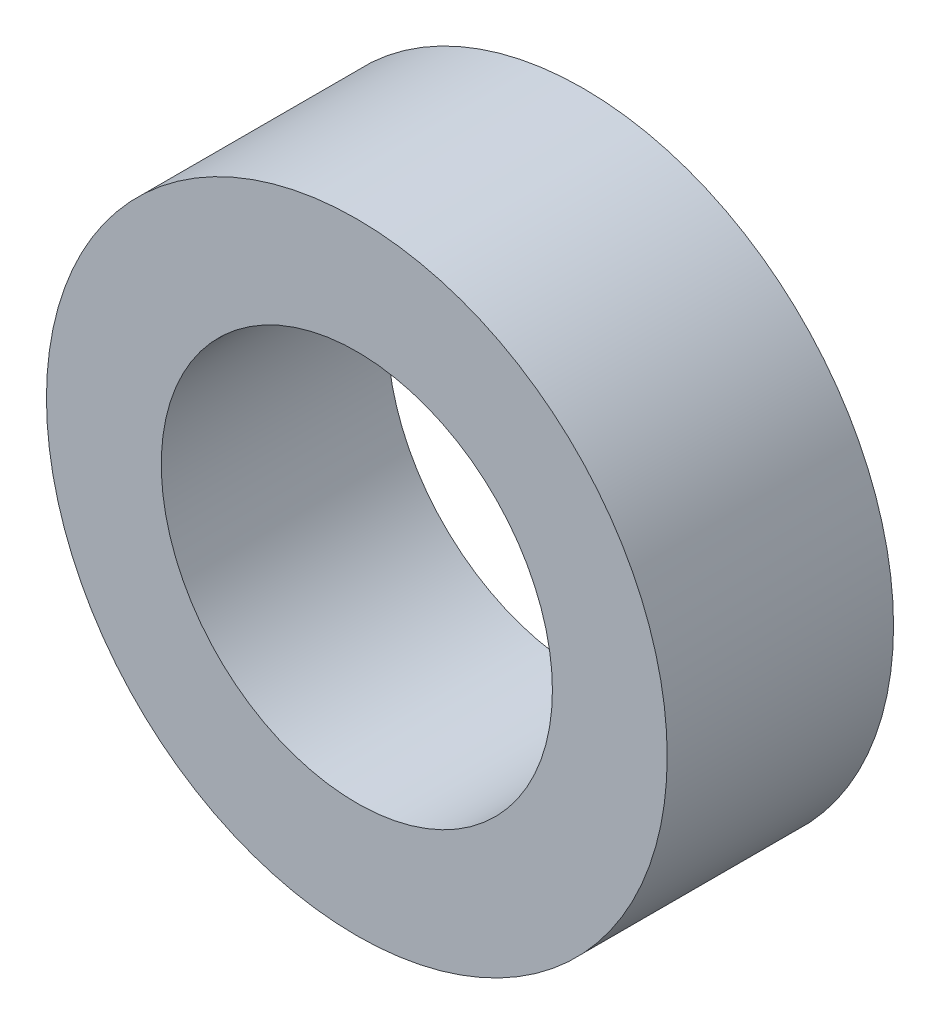
ISO-10303-21;
HEADER;
FILE_DESCRIPTION(('STEP AP214'),'2;1');
FILE_NAME('part.step','',(''),(''),'','','');
FILE_SCHEMA(('AUTOMOTIVE_DESIGN { 1 0 10303 214 1 1 1 1 }'));
ENDSEC;
DATA;
#1=APPLICATION_CONTEXT('core data for automotive mechanical design processes');
#2=APPLICATION_PROTOCOL_DEFINITION('international standard','automotive_design',2000,#1);
#3=PRODUCT_CONTEXT('',#1,'mechanical');
#4=PRODUCT('Part','Part','',(#3));
#5=PRODUCT_RELATED_PRODUCT_CATEGORY('part','',(#4));
#6=PRODUCT_DEFINITION_FORMATION('','',#4);
#7=PRODUCT_DEFINITION_CONTEXT('part definition',#1,'design');
#8=PRODUCT_DEFINITION('design','',#6,#7);
#9=PRODUCT_DEFINITION_SHAPE('','',#8);
#10=(LENGTH_UNIT() NAMED_UNIT(*) SI_UNIT(.MILLI.,.METRE.));
#11=(NAMED_UNIT(*) PLANE_ANGLE_UNIT() SI_UNIT($,.RADIAN.));
#12=(NAMED_UNIT(*) SI_UNIT($,.STERADIAN.) SOLID_ANGLE_UNIT());
#13=UNCERTAINTY_MEASURE_WITH_UNIT(LENGTH_MEASURE(1.E-05),#10,'distance_accuracy_value','');
#14=(GEOMETRIC_REPRESENTATION_CONTEXT(3) GLOBAL_UNCERTAINTY_ASSIGNED_CONTEXT((#13)) GLOBAL_UNIT_ASSIGNED_CONTEXT((#10,
#11,#12)) REPRESENTATION_CONTEXT('',''));
#15=CARTESIAN_POINT('',(0.,0.,0.));
#16=DIRECTION('',(0.,0.,1.));
#17=DIRECTION('',(1.,0.,0.));
#18=AXIS2_PLACEMENT_3D('',#15,#16,#17);
#19=CARTESIAN_POINT('',(0.,0.,3.46));
#20=DIRECTION('',(0.,0.,1.));
#21=DIRECTION('',(1.,0.,0.));
#22=AXIS2_PLACEMENT_3D('',#19,#20,#21);
#23=PLANE('',#22);
#24=CARTESIAN_POINT('',(0.,0.,3.46));
#25=DIRECTION('',(0.,0.,1.));
#26=DIRECTION('',(1.,0.,0.));
#27=AXIS2_PLACEMENT_3D('',#24,#25,#26);
#28=CIRCLE('',#27,4.745);
#29=CARTESIAN_POINT('',(4.745,0.,3.46));
#30=VERTEX_POINT('',#29);
#31=EDGE_CURVE('E10',#30,#30,#28,.T.);
#32=ORIENTED_EDGE('',*,*,#31,.T.);
#33=EDGE_LOOP('',(#32));
#34=FACE_BOUND('',#33,.T.);
#35=CARTESIAN_POINT('',(0.,0.,3.46));
#36=DIRECTION('',(0.,0.,1.));
#37=DIRECTION('',(1.,0.,0.));
#38=AXIS2_PLACEMENT_3D('',#35,#36,#37);
#39=CIRCLE('',#38,2.99);
#40=CARTESIAN_POINT('',(2.99,0.,3.46));
#41=VERTEX_POINT('',#40);
#42=EDGE_CURVE('E43',#41,#41,#39,.T.);
#43=ORIENTED_EDGE('',*,*,#42,.F.);
#44=EDGE_LOOP('',(#43));
#45=FACE_BOUND('',#44,.T.);
#46=ADVANCED_FACE('F32',(#34,#45),#23,.T.);
#47=CARTESIAN_POINT('',(0.,0.,0.));
#48=DIRECTION('',(0.,0.,1.));
#49=DIRECTION('',(1.,0.,0.));
#50=AXIS2_PLACEMENT_3D('',#47,#48,#49);
#51=PLANE('',#50);
#52=CARTESIAN_POINT('',(0.,0.,0.));
#53=DIRECTION('',(0.,0.,1.));
#54=DIRECTION('',(1.,0.,0.));
#55=AXIS2_PLACEMENT_3D('',#52,#53,#54);
#56=CIRCLE('',#55,4.745);
#57=CARTESIAN_POINT('',(4.745,0.,0.));
#58=VERTEX_POINT('',#57);
#59=EDGE_CURVE('E36',#58,#58,#56,.T.);
#60=ORIENTED_EDGE('',*,*,#59,.F.);
#61=EDGE_LOOP('',(#60));
#62=FACE_BOUND('',#61,.T.);
#63=CARTESIAN_POINT('',(0.,0.,0.));
#64=DIRECTION('',(0.,0.,1.));
#65=DIRECTION('',(1.,0.,0.));
#66=AXIS2_PLACEMENT_3D('',#63,#64,#65);
#67=CIRCLE('',#66,2.99);
#68=CARTESIAN_POINT('',(2.99,0.,0.));
#69=VERTEX_POINT('',#68);
#70=EDGE_CURVE('E45',#69,#69,#67,.T.);
#71=ORIENTED_EDGE('',*,*,#70,.T.);
#72=EDGE_LOOP('',(#71));
#73=FACE_BOUND('',#72,.T.);
#74=ADVANCED_FACE('F55',(#62,#73),#51,.F.);
#75=CARTESIAN_POINT('',(0.,0.,3.46));
#76=DIRECTION('',(0.,0.,-1.));
#77=DIRECTION('',(-1.,0.,0.));
#78=AXIS2_PLACEMENT_3D('',#75,#76,#77);
#79=CYLINDRICAL_SURFACE('',#78,4.745);
#80=ORIENTED_EDGE('',*,*,#31,.F.);
#81=EDGE_LOOP('',(#80));
#82=FACE_BOUND('',#81,.T.);
#83=ORIENTED_EDGE('',*,*,#59,.T.);
#84=EDGE_LOOP('',(#83));
#85=FACE_BOUND('',#84,.T.);
#86=ADVANCED_FACE('F34',(#82,#85),#79,.T.);
#87=CARTESIAN_POINT('',(0.,0.,3.46));
#88=DIRECTION('',(0.,0.,-1.));
#89=DIRECTION('',(-1.,0.,0.));
#90=AXIS2_PLACEMENT_3D('',#87,#88,#89);
#91=CYLINDRICAL_SURFACE('',#90,2.99);
#92=ORIENTED_EDGE('',*,*,#42,.T.);
#93=EDGE_LOOP('',(#92));
#94=FACE_BOUND('',#93,.T.);
#95=ORIENTED_EDGE('',*,*,#70,.F.);
#96=EDGE_LOOP('',(#95));
#97=FACE_BOUND('',#96,.T.);
#98=ADVANCED_FACE('F51',(#94,#97),#91,.F.);
#99=CLOSED_SHELL('',(#46,#74,#86,#98));
#100=MANIFOLD_SOLID_BREP('B2',#99);
#101=ADVANCED_BREP_SHAPE_REPRESENTATION('',(#18,#100),#14);
#102=SHAPE_DEFINITION_REPRESENTATION(#9,#101);
ENDSEC;
END-ISO-10303-21;
